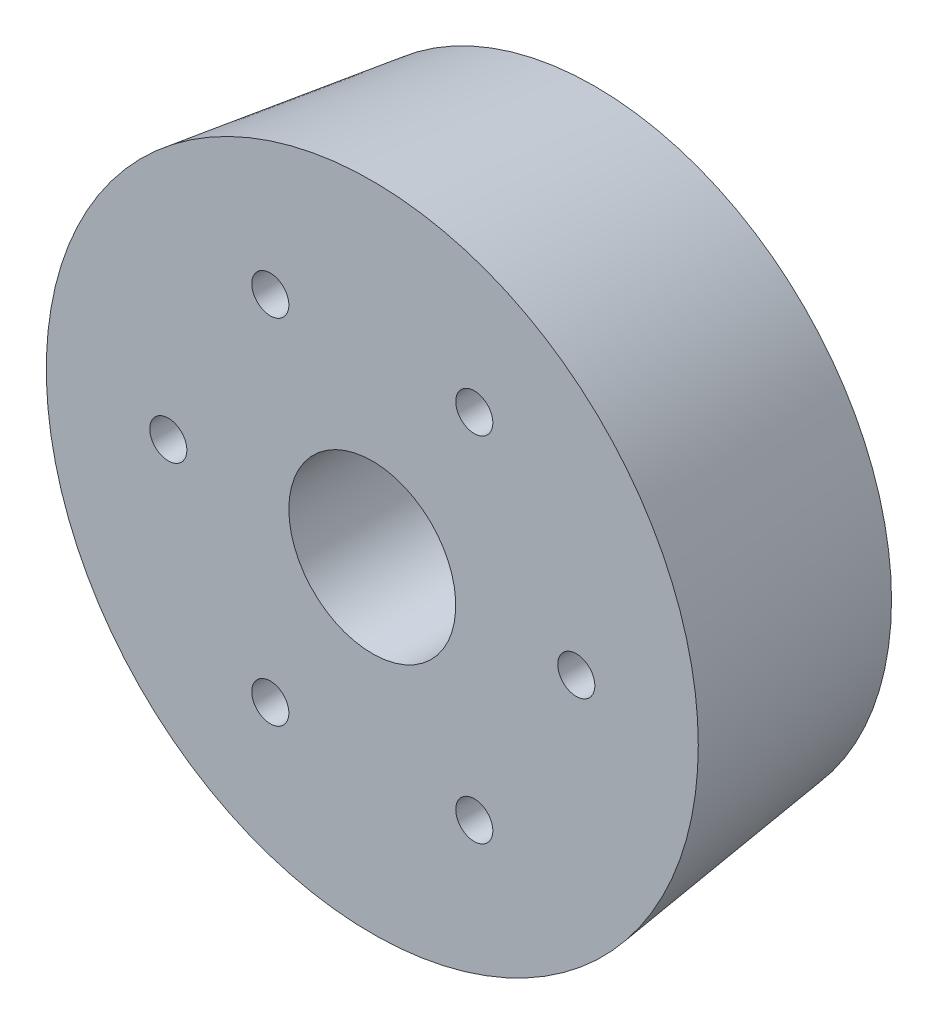
ISO-10303-21;
HEADER;
FILE_DESCRIPTION(('STEP AP214'),'2;1');
FILE_NAME('part.step','',(''),(''),'','','');
FILE_SCHEMA(('AUTOMOTIVE_DESIGN { 1 0 10303 214 1 1 1 1 }'));
ENDSEC;
DATA;
#1=APPLICATION_CONTEXT('core data for automotive mechanical design processes');
#2=APPLICATION_PROTOCOL_DEFINITION('international standard','automotive_design',2000,#1);
#3=PRODUCT_CONTEXT('',#1,'mechanical');
#4=PRODUCT('Part','Part','',(#3));
#5=PRODUCT_RELATED_PRODUCT_CATEGORY('part','',(#4));
#6=PRODUCT_DEFINITION_FORMATION('','',#4);
#7=PRODUCT_DEFINITION_CONTEXT('part definition',#1,'design');
#8=PRODUCT_DEFINITION('design','',#6,#7);
#9=PRODUCT_DEFINITION_SHAPE('','',#8);
#10=(LENGTH_UNIT() NAMED_UNIT(*) SI_UNIT(.MILLI.,.METRE.));
#11=(NAMED_UNIT(*) PLANE_ANGLE_UNIT() SI_UNIT($,.RADIAN.));
#12=(NAMED_UNIT(*) SI_UNIT($,.STERADIAN.) SOLID_ANGLE_UNIT());
#13=UNCERTAINTY_MEASURE_WITH_UNIT(LENGTH_MEASURE(1.E-05),#10,'distance_accuracy_value','');
#14=(GEOMETRIC_REPRESENTATION_CONTEXT(3) GLOBAL_UNCERTAINTY_ASSIGNED_CONTEXT((#13)) GLOBAL_UNIT_ASSIGNED_CONTEXT((#10,
#11,#12)) REPRESENTATION_CONTEXT('',''));
#15=CARTESIAN_POINT('',(0.,0.,0.));
#16=DIRECTION('',(0.,0.,1.));
#17=DIRECTION('',(1.,0.,0.));
#18=AXIS2_PLACEMENT_3D('',#15,#16,#17);
#19=CARTESIAN_POINT('',(0.,0.,0.));
#20=DIRECTION('',(0.,0.,1.));
#21=DIRECTION('',(1.,0.,0.));
#22=AXIS2_PLACEMENT_3D('',#19,#20,#21);
#23=CONICAL_SURFACE('',#22,50.8,0.130899693899575);
#24=CARTESIAN_POINT('',(0.,0.,38.1));
#25=DIRECTION('',(0.,0.,1.));
#26=DIRECTION('',(1.,0.,0.));
#27=AXIS2_PLACEMENT_3D('',#24,#25,#26);
#28=CIRCLE('',#27,55.8159601580798);
#29=CARTESIAN_POINT('',(55.8159601580798,0.,38.1));
#30=VERTEX_POINT('',#29);
#31=EDGE_CURVE('E10',#30,#30,#28,.T.);
#32=ORIENTED_EDGE('',*,*,#31,.F.);
#33=EDGE_LOOP('',(#32));
#34=FACE_BOUND('',#33,.T.);
#35=CARTESIAN_POINT('',(0.,0.,0.));
#36=DIRECTION('',(0.,0.,1.));
#37=DIRECTION('',(1.,0.,0.));
#38=AXIS2_PLACEMENT_3D('',#35,#36,#37);
#39=CIRCLE('',#38,50.8);
#40=CARTESIAN_POINT('',(50.8,0.,0.));
#41=VERTEX_POINT('',#40);
#42=EDGE_CURVE('E39',#41,#41,#39,.T.);
#43=ORIENTED_EDGE('',*,*,#42,.T.);
#44=EDGE_LOOP('',(#43));
#45=FACE_BOUND('',#44,.T.);
#46=ADVANCED_FACE('F33',(#34,#45),#23,.T.);
#47=CARTESIAN_POINT('',(0.,0.,38.1));
#48=DIRECTION('',(0.,0.,1.));
#49=DIRECTION('',(1.,0.,0.));
#50=AXIS2_PLACEMENT_3D('',#47,#48,#49);
#51=PLANE('',#50);
#52=CARTESIAN_POINT('',(-17.4625000000004,30.2459372271713,38.1));
#53=DIRECTION('',(0.,0.,-1.));
#54=DIRECTION('',(-1.,0.,0.));
#55=AXIS2_PLACEMENT_3D('',#52,#53,#54);
#56=CIRCLE('',#55,3.175);
#57=CARTESIAN_POINT('',(-20.6375000000004,30.2459372271713,38.1));
#58=VERTEX_POINT('',#57);
#59=EDGE_CURVE('E84',#58,#58,#56,.T.);
#60=ORIENTED_EDGE('',*,*,#59,.T.);
#61=EDGE_LOOP('',(#60));
#62=FACE_BOUND('',#61,.T.);
#63=CARTESIAN_POINT('',(17.4624999999997,30.2459372271717,38.1));
#64=DIRECTION('',(0.,0.,-1.));
#65=DIRECTION('',(-1.,0.,0.));
#66=AXIS2_PLACEMENT_3D('',#63,#64,#65);
#67=CIRCLE('',#66,3.175);
#68=CARTESIAN_POINT('',(14.2874999999997,30.2459372271717,38.1));
#69=VERTEX_POINT('',#68);
#70=EDGE_CURVE('E78',#69,#69,#67,.T.);
#71=ORIENTED_EDGE('',*,*,#70,.T.);
#72=EDGE_LOOP('',(#71));
#73=FACE_BOUND('',#72,.T.);
#74=CARTESIAN_POINT('',(34.925,2.43879971518193E-13,38.1));
#75=DIRECTION('',(0.,0.,-1.));
#76=DIRECTION('',(-1.,0.,0.));
#77=AXIS2_PLACEMENT_3D('',#74,#75,#76);
#78=CIRCLE('',#77,3.175);
#79=CARTESIAN_POINT('',(31.75,2.43879971518193E-13,38.1));
#80=VERTEX_POINT('',#79);
#81=EDGE_CURVE('E72',#80,#80,#78,.T.);
#82=ORIENTED_EDGE('',*,*,#81,.T.);
#83=EDGE_LOOP('',(#82));
#84=FACE_BOUND('',#83,.T.);
#85=CARTESIAN_POINT('',(17.4625000000001,-30.2459372271714,38.1));
#86=DIRECTION('',(0.,0.,-1.));
#87=DIRECTION('',(-1.,0.,0.));
#88=AXIS2_PLACEMENT_3D('',#85,#86,#87);
#89=CIRCLE('',#88,3.175);
#90=CARTESIAN_POINT('',(14.2875000000001,-30.2459372271714,38.1));
#91=VERTEX_POINT('',#90);
#92=EDGE_CURVE('E66',#91,#91,#89,.T.);
#93=ORIENTED_EDGE('',*,*,#92,.T.);
#94=EDGE_LOOP('',(#93));
#95=FACE_BOUND('',#94,.T.);
#96=CARTESIAN_POINT('',(-17.4624999999999,-30.2459372271716,38.1));
#97=DIRECTION('',(0.,0.,-1.));
#98=DIRECTION('',(-1.,0.,0.));
#99=AXIS2_PLACEMENT_3D('',#96,#97,#98);
#100=CIRCLE('',#99,3.17499999999999);
#101=CARTESIAN_POINT('',(-20.6374999999999,-30.2459372271716,38.1));
#102=VERTEX_POINT('',#101);
#103=EDGE_CURVE('E59',#102,#102,#100,.T.);
#104=ORIENTED_EDGE('',*,*,#103,.T.);
#105=EDGE_LOOP('',(#104));
#106=FACE_BOUND('',#105,.T.);
#107=CARTESIAN_POINT('',(-34.925,0.,38.1));
#108=DIRECTION('',(0.,0.,-1.));
#109=DIRECTION('',(-1.,0.,0.));
#110=AXIS2_PLACEMENT_3D('',#107,#108,#109);
#111=CIRCLE('',#110,3.175);
#112=CARTESIAN_POINT('',(-38.1,0.,38.1));
#113=VERTEX_POINT('',#112);
#114=EDGE_CURVE('E54',#113,#113,#111,.T.);
#115=ORIENTED_EDGE('',*,*,#114,.T.);
#116=EDGE_LOOP('',(#115));
#117=FACE_BOUND('',#116,.T.);
#118=CARTESIAN_POINT('',(0.,0.,38.1));
#119=DIRECTION('',(0.,0.,-1.));
#120=DIRECTION('',(-1.,0.,0.));
#121=AXIS2_PLACEMENT_3D('',#118,#119,#120);
#122=CIRCLE('',#121,14.2875);
#123=CARTESIAN_POINT('',(-14.2875,0.,38.1));
#124=VERTEX_POINT('',#123);
#125=EDGE_CURVE('E44',#124,#124,#122,.T.);
#126=ORIENTED_EDGE('',*,*,#125,.T.);
#127=EDGE_LOOP('',(#126));
#128=FACE_BOUND('',#127,.T.);
#129=ORIENTED_EDGE('',*,*,#31,.T.);
#130=EDGE_LOOP('',(#129));
#131=FACE_BOUND('',#130,.T.);
#132=ADVANCED_FACE('F93',(#62,#73,#84,#95,#106,#117,#128,#131),#51,.T.);
#133=CARTESIAN_POINT('',(0.,0.,0.));
#134=DIRECTION('',(0.,0.,1.));
#135=DIRECTION('',(1.,0.,0.));
#136=AXIS2_PLACEMENT_3D('',#133,#134,#135);
#137=PLANE('',#136);
#138=CARTESIAN_POINT('',(-17.4625000000004,30.2459372271713,0.));
#139=DIRECTION('',(0.,0.,-1.));
#140=DIRECTION('',(-1.,0.,0.));
#141=AXIS2_PLACEMENT_3D('',#138,#139,#140);
#142=CIRCLE('',#141,3.175);
#143=CARTESIAN_POINT('',(-20.6375000000004,30.2459372271713,0.));
#144=VERTEX_POINT('',#143);
#145=EDGE_CURVE('E87',#144,#144,#142,.T.);
#146=ORIENTED_EDGE('',*,*,#145,.F.);
#147=EDGE_LOOP('',(#146));
#148=FACE_BOUND('',#147,.T.);
#149=CARTESIAN_POINT('',(17.4624999999997,30.2459372271717,0.));
#150=DIRECTION('',(0.,0.,-1.));
#151=DIRECTION('',(-1.,0.,0.));
#152=AXIS2_PLACEMENT_3D('',#149,#150,#151);
#153=CIRCLE('',#152,3.175);
#154=CARTESIAN_POINT('',(14.2874999999997,30.2459372271717,0.));
#155=VERTEX_POINT('',#154);
#156=EDGE_CURVE('E81',#155,#155,#153,.T.);
#157=ORIENTED_EDGE('',*,*,#156,.F.);
#158=EDGE_LOOP('',(#157));
#159=FACE_BOUND('',#158,.T.);
#160=CARTESIAN_POINT('',(34.925,2.43879971518193E-13,0.));
#161=DIRECTION('',(0.,0.,-1.));
#162=DIRECTION('',(-1.,0.,0.));
#163=AXIS2_PLACEMENT_3D('',#160,#161,#162);
#164=CIRCLE('',#163,3.175);
#165=CARTESIAN_POINT('',(31.75,2.43879971518193E-13,0.));
#166=VERTEX_POINT('',#165);
#167=EDGE_CURVE('E75',#166,#166,#164,.T.);
#168=ORIENTED_EDGE('',*,*,#167,.F.);
#169=EDGE_LOOP('',(#168));
#170=FACE_BOUND('',#169,.T.);
#171=CARTESIAN_POINT('',(17.4625000000001,-30.2459372271714,0.));
#172=DIRECTION('',(0.,0.,-1.));
#173=DIRECTION('',(-1.,0.,0.));
#174=AXIS2_PLACEMENT_3D('',#171,#172,#173);
#175=CIRCLE('',#174,3.175);
#176=CARTESIAN_POINT('',(14.2875000000001,-30.2459372271714,0.));
#177=VERTEX_POINT('',#176);
#178=EDGE_CURVE('E69',#177,#177,#175,.T.);
#179=ORIENTED_EDGE('',*,*,#178,.F.);
#180=EDGE_LOOP('',(#179));
#181=FACE_BOUND('',#180,.T.);
#182=CARTESIAN_POINT('',(-17.4624999999999,-30.2459372271716,0.));
#183=DIRECTION('',(0.,0.,-1.));
#184=DIRECTION('',(-1.,0.,0.));
#185=AXIS2_PLACEMENT_3D('',#182,#183,#184);
#186=CIRCLE('',#185,3.17499999999999);
#187=CARTESIAN_POINT('',(-20.6374999999999,-30.2459372271716,0.));
#188=VERTEX_POINT('',#187);
#189=EDGE_CURVE('E63',#188,#188,#186,.T.);
#190=ORIENTED_EDGE('',*,*,#189,.F.);
#191=EDGE_LOOP('',(#190));
#192=FACE_BOUND('',#191,.T.);
#193=CARTESIAN_POINT('',(-34.925,0.,0.));
#194=DIRECTION('',(0.,0.,-1.));
#195=DIRECTION('',(-1.,0.,0.));
#196=AXIS2_PLACEMENT_3D('',#193,#194,#195);
#197=CIRCLE('',#196,3.175);
#198=CARTESIAN_POINT('',(-38.1,0.,0.));
#199=VERTEX_POINT('',#198);
#200=EDGE_CURVE('E56',#199,#199,#197,.T.);
#201=ORIENTED_EDGE('',*,*,#200,.F.);
#202=EDGE_LOOP('',(#201));
#203=FACE_BOUND('',#202,.T.);
#204=CARTESIAN_POINT('',(0.,0.,0.));
#205=DIRECTION('',(0.,0.,-1.));
#206=DIRECTION('',(-1.,0.,0.));
#207=AXIS2_PLACEMENT_3D('',#204,#205,#206);
#208=CIRCLE('',#207,14.2875);
#209=CARTESIAN_POINT('',(-14.2875,0.,0.));
#210=VERTEX_POINT('',#209);
#211=EDGE_CURVE('E50',#210,#210,#208,.T.);
#212=ORIENTED_EDGE('',*,*,#211,.F.);
#213=EDGE_LOOP('',(#212));
#214=FACE_BOUND('',#213,.T.);
#215=ORIENTED_EDGE('',*,*,#42,.F.);
#216=EDGE_LOOP('',(#215));
#217=FACE_BOUND('',#216,.T.);
#218=ADVANCED_FACE('F103',(#148,#159,#170,#181,#192,#203,#214,#217),#137,.F.);
#219=CARTESIAN_POINT('',(0.,0.,38.1));
#220=DIRECTION('',(0.,0.,-1.));
#221=DIRECTION('',(-1.,0.,0.));
#222=AXIS2_PLACEMENT_3D('',#219,#220,#221);
#223=CYLINDRICAL_SURFACE('',#222,14.2875);
#224=CARTESIAN_POINT('',(-14.2875,0.,38.1));
#225=CARTESIAN_POINT('',(-14.2875,0.,37.703125));
#226=CARTESIAN_POINT('',(-14.2875,0.,37.30625));
#227=CARTESIAN_POINT('',(-14.2875,0.,36.5125));
#228=CARTESIAN_POINT('',(-14.2875,0.,36.115625));
#229=CARTESIAN_POINT('',(-14.2875,0.,35.321875));
#230=CARTESIAN_POINT('',(-14.2875,0.,34.925));
#231=CARTESIAN_POINT('',(-14.2875,0.,34.13125));
#232=CARTESIAN_POINT('',(-14.2875,0.,33.734375));
#233=CARTESIAN_POINT('',(-14.2875,0.,32.940625));
#234=CARTESIAN_POINT('',(-14.2875,0.,32.54375));
#235=CARTESIAN_POINT('',(-14.2875,0.,31.75));
#236=CARTESIAN_POINT('',(-14.2875,0.,31.353125));
#237=CARTESIAN_POINT('',(-14.2875,0.,30.559375));
#238=CARTESIAN_POINT('',(-14.2875,0.,30.1625));
#239=CARTESIAN_POINT('',(-14.2875,0.,29.36875));
#240=CARTESIAN_POINT('',(-14.2875,0.,28.971875));
#241=CARTESIAN_POINT('',(-14.2875,0.,28.178125));
#242=CARTESIAN_POINT('',(-14.2875,0.,27.78125));
#243=CARTESIAN_POINT('',(-14.2875,0.,26.9875));
#244=CARTESIAN_POINT('',(-14.2875,0.,26.590625));
#245=CARTESIAN_POINT('',(-14.2875,0.,25.796875));
#246=CARTESIAN_POINT('',(-14.2875,0.,25.4));
#247=CARTESIAN_POINT('',(-14.2875,0.,24.60625));
#248=CARTESIAN_POINT('',(-14.2875,0.,24.209375));
#249=CARTESIAN_POINT('',(-14.2875,0.,23.415625));
#250=CARTESIAN_POINT('',(-14.2875,0.,23.01875));
#251=CARTESIAN_POINT('',(-14.2875,0.,22.225));
#252=CARTESIAN_POINT('',(-14.2875,0.,21.828125));
#253=CARTESIAN_POINT('',(-14.2875,0.,21.034375));
#254=CARTESIAN_POINT('',(-14.2875,0.,20.6375));
#255=CARTESIAN_POINT('',(-14.2875,0.,19.84375));
#256=CARTESIAN_POINT('',(-14.2875,0.,19.446875));
#257=CARTESIAN_POINT('',(-14.2875,0.,18.653125));
#258=CARTESIAN_POINT('',(-14.2875,0.,18.25625));
#259=CARTESIAN_POINT('',(-14.2875,0.,17.4625));
#260=CARTESIAN_POINT('',(-14.2875,0.,17.065625));
#261=CARTESIAN_POINT('',(-14.2875,0.,16.271875));
#262=CARTESIAN_POINT('',(-14.2875,0.,15.875));
#263=CARTESIAN_POINT('',(-14.2875,0.,15.08125));
#264=CARTESIAN_POINT('',(-14.2875,0.,14.684375));
#265=CARTESIAN_POINT('',(-14.2875,0.,13.890625));
#266=CARTESIAN_POINT('',(-14.2875,0.,13.49375));
#267=CARTESIAN_POINT('',(-14.2875,0.,12.7));
#268=CARTESIAN_POINT('',(-14.2875,0.,12.303125));
#269=CARTESIAN_POINT('',(-14.2875,0.,11.509375));
#270=CARTESIAN_POINT('',(-14.2875,0.,11.1125));
#271=CARTESIAN_POINT('',(-14.2875,0.,10.31875));
#272=CARTESIAN_POINT('',(-14.2875,0.,9.921875));
#273=CARTESIAN_POINT('',(-14.2875,0.,9.128125));
#274=CARTESIAN_POINT('',(-14.2875,0.,8.73125));
#275=CARTESIAN_POINT('',(-14.2875,0.,7.9375));
#276=CARTESIAN_POINT('',(-14.2875,0.,7.540625));
#277=CARTESIAN_POINT('',(-14.2875,0.,6.746875));
#278=CARTESIAN_POINT('',(-14.2875,0.,6.35));
#279=CARTESIAN_POINT('',(-14.2875,0.,5.55625));
#280=CARTESIAN_POINT('',(-14.2875,0.,5.159375));
#281=CARTESIAN_POINT('',(-14.2875,0.,4.365625));
#282=CARTESIAN_POINT('',(-14.2875,0.,3.96875));
#283=CARTESIAN_POINT('',(-14.2875,0.,3.175));
#284=CARTESIAN_POINT('',(-14.2875,0.,2.778125));
#285=CARTESIAN_POINT('',(-14.2875,0.,1.984375));
#286=CARTESIAN_POINT('',(-14.2875,0.,1.5875));
#287=CARTESIAN_POINT('',(-14.2875,0.,0.79375));
#288=CARTESIAN_POINT('',(-14.2875,0.,0.396875));
#289=CARTESIAN_POINT('',(-14.2875,0.,0.));
#290=B_SPLINE_CURVE_WITH_KNOTS('',3,(#224,#225,#226,#227,#228,#229,#230,#231,#232,#233,#234,
#235,#236,#237,#238,#239,#240,#241,#242,#243,#244,#245,#246,#247,#248,#249,#250,#251,#252,#253,
#254,#255,#256,#257,#258,#259,#260,#261,#262,#263,#264,#265,#266,#267,#268,#269,#270,#271,#272,
#273,#274,#275,#276,#277,#278,#279,#280,#281,#282,#283,#284,#285,#286,#287,#288,#289),
.UNSPECIFIED.,.F.,.F.,(4,2,2,2,2,2,2,2,2,2,2,2,2,2,2,2,2,2,2,2,2,2,2,2,2,2,2,2,2,2,2,2,4),(0.,
1.190625,2.38125,3.571875,4.7625,5.953125,7.14375,8.334375,9.52500000000001,10.715625,11.90625,
13.096875,14.2875,15.478125,16.66875,17.859375,19.05,20.240625,21.43125,22.621875,23.8125,
25.003125,26.19375,27.384375,28.575,29.765625,30.95625,32.146875,33.3375,34.528125,35.71875,
36.909375,38.1),.UNSPECIFIED.);
#291=EDGE_CURVE('BSEAM106',#124,#210,#290,.T.);
#292=ORIENTED_EDGE('',*,*,#125,.F.);
#293=ORIENTED_EDGE('',*,*,#211,.T.);
#294=ORIENTED_EDGE('',*,*,#291,.T.);
#295=ORIENTED_EDGE('',*,*,#291,.F.);
#296=EDGE_LOOP('',(#292,#294,#293,#295));
#297=FACE_BOUND('',#296,.T.);
#298=ADVANCED_FACE('F106',(#297),#223,.F.);
#299=CARTESIAN_POINT('',(-34.925,0.,38.1));
#300=DIRECTION('',(0.,0.,-1.));
#301=DIRECTION('',(-1.,0.,0.));
#302=AXIS2_PLACEMENT_3D('',#299,#300,#301);
#303=CYLINDRICAL_SURFACE('',#302,3.175);
#304=CARTESIAN_POINT('',(-38.1,0.,38.1));
#305=CARTESIAN_POINT('',(-38.1,0.,37.703125));
#306=CARTESIAN_POINT('',(-38.1,0.,37.30625));
#307=CARTESIAN_POINT('',(-38.1,0.,36.5125));
#308=CARTESIAN_POINT('',(-38.1,0.,36.115625));
#309=CARTESIAN_POINT('',(-38.1,0.,35.321875));
#310=CARTESIAN_POINT('',(-38.1,0.,34.925));
#311=CARTESIAN_POINT('',(-38.1,0.,34.13125));
#312=CARTESIAN_POINT('',(-38.1,0.,33.734375));
#313=CARTESIAN_POINT('',(-38.1,0.,32.940625));
#314=CARTESIAN_POINT('',(-38.1,0.,32.54375));
#315=CARTESIAN_POINT('',(-38.1,0.,31.75));
#316=CARTESIAN_POINT('',(-38.1,0.,31.353125));
#317=CARTESIAN_POINT('',(-38.1,0.,30.559375));
#318=CARTESIAN_POINT('',(-38.1,0.,30.1625));
#319=CARTESIAN_POINT('',(-38.1,0.,29.36875));
#320=CARTESIAN_POINT('',(-38.1,0.,28.971875));
#321=CARTESIAN_POINT('',(-38.1,0.,28.178125));
#322=CARTESIAN_POINT('',(-38.1,0.,27.78125));
#323=CARTESIAN_POINT('',(-38.1,0.,26.9875));
#324=CARTESIAN_POINT('',(-38.1,0.,26.590625));
#325=CARTESIAN_POINT('',(-38.1,0.,25.796875));
#326=CARTESIAN_POINT('',(-38.1,0.,25.4));
#327=CARTESIAN_POINT('',(-38.1,0.,24.60625));
#328=CARTESIAN_POINT('',(-38.1,0.,24.209375));
#329=CARTESIAN_POINT('',(-38.1,0.,23.415625));
#330=CARTESIAN_POINT('',(-38.1,0.,23.01875));
#331=CARTESIAN_POINT('',(-38.1,0.,22.225));
#332=CARTESIAN_POINT('',(-38.1,0.,21.828125));
#333=CARTESIAN_POINT('',(-38.1,0.,21.034375));
#334=CARTESIAN_POINT('',(-38.1,0.,20.6375));
#335=CARTESIAN_POINT('',(-38.1,0.,19.84375));
#336=CARTESIAN_POINT('',(-38.1,0.,19.446875));
#337=CARTESIAN_POINT('',(-38.1,0.,18.653125));
#338=CARTESIAN_POINT('',(-38.1,0.,18.25625));
#339=CARTESIAN_POINT('',(-38.1,0.,17.4625));
#340=CARTESIAN_POINT('',(-38.1,0.,17.065625));
#341=CARTESIAN_POINT('',(-38.1,0.,16.271875));
#342=CARTESIAN_POINT('',(-38.1,0.,15.875));
#343=CARTESIAN_POINT('',(-38.1,0.,15.08125));
#344=CARTESIAN_POINT('',(-38.1,0.,14.684375));
#345=CARTESIAN_POINT('',(-38.1,0.,13.890625));
#346=CARTESIAN_POINT('',(-38.1,0.,13.49375));
#347=CARTESIAN_POINT('',(-38.1,0.,12.7));
#348=CARTESIAN_POINT('',(-38.1,0.,12.303125));
#349=CARTESIAN_POINT('',(-38.1,0.,11.509375));
#350=CARTESIAN_POINT('',(-38.1,0.,11.1125));
#351=CARTESIAN_POINT('',(-38.1,0.,10.31875));
#352=CARTESIAN_POINT('',(-38.1,0.,9.921875));
#353=CARTESIAN_POINT('',(-38.1,0.,9.128125));
#354=CARTESIAN_POINT('',(-38.1,0.,8.73125));
#355=CARTESIAN_POINT('',(-38.1,0.,7.9375));
#356=CARTESIAN_POINT('',(-38.1,0.,7.540625));
#357=CARTESIAN_POINT('',(-38.1,0.,6.746875));
#358=CARTESIAN_POINT('',(-38.1,0.,6.35));
#359=CARTESIAN_POINT('',(-38.1,0.,5.55625));
#360=CARTESIAN_POINT('',(-38.1,0.,5.159375));
#361=CARTESIAN_POINT('',(-38.1,0.,4.365625));
#362=CARTESIAN_POINT('',(-38.1,0.,3.96875));
#363=CARTESIAN_POINT('',(-38.1,0.,3.175));
#364=CARTESIAN_POINT('',(-38.1,0.,2.778125));
#365=CARTESIAN_POINT('',(-38.1,0.,1.984375));
#366=CARTESIAN_POINT('',(-38.1,0.,1.5875));
#367=CARTESIAN_POINT('',(-38.1,0.,0.79375));
#368=CARTESIAN_POINT('',(-38.1,0.,0.396875));
#369=CARTESIAN_POINT('',(-38.1,0.,0.));
#370=B_SPLINE_CURVE_WITH_KNOTS('',3,(#304,#305,#306,#307,#308,#309,#310,#311,#312,#313,#314,
#315,#316,#317,#318,#319,#320,#321,#322,#323,#324,#325,#326,#327,#328,#329,#330,#331,#332,#333,
#334,#335,#336,#337,#338,#339,#340,#341,#342,#343,#344,#345,#346,#347,#348,#349,#350,#351,#352,
#353,#354,#355,#356,#357,#358,#359,#360,#361,#362,#363,#364,#365,#366,#367,#368,#369),
.UNSPECIFIED.,.F.,.F.,(4,2,2,2,2,2,2,2,2,2,2,2,2,2,2,2,2,2,2,2,2,2,2,2,2,2,2,2,2,2,2,2,4),(0.,
1.190625,2.38125,3.571875,4.7625,5.953125,7.14375,8.334375,9.52500000000001,10.715625,11.90625,
13.096875,14.2875,15.478125,16.66875,17.859375,19.05,20.240625,21.43125,22.621875,23.8125,
25.003125,26.19375,27.384375,28.575,29.765625,30.95625,32.146875,33.3375,34.528125,35.71875,
36.909375,38.1),.UNSPECIFIED.);
#371=EDGE_CURVE('BSEAM121',#113,#199,#370,.T.);
#372=ORIENTED_EDGE('',*,*,#114,.F.);
#373=ORIENTED_EDGE('',*,*,#200,.T.);
#374=ORIENTED_EDGE('',*,*,#371,.T.);
#375=ORIENTED_EDGE('',*,*,#371,.F.);
#376=EDGE_LOOP('',(#372,#374,#373,#375));
#377=FACE_BOUND('',#376,.T.);
#378=ADVANCED_FACE('F121',(#377),#303,.F.);
#379=CARTESIAN_POINT('',(-17.4624999999999,-30.2459372271716,38.1));
#380=DIRECTION('',(0.,0.,-1.));
#381=DIRECTION('',(-1.,0.,0.));
#382=AXIS2_PLACEMENT_3D('',#379,#380,#381);
#383=CYLINDRICAL_SURFACE('',#382,3.17499999999999);
#384=CARTESIAN_POINT('',(-20.6374999999999,-30.2459372271716,38.1));
#385=CARTESIAN_POINT('',(-20.6374999999999,-30.2459372271716,37.703125));
#386=CARTESIAN_POINT('',(-20.6374999999999,-30.2459372271716,37.30625));
#387=CARTESIAN_POINT('',(-20.6374999999999,-30.2459372271716,36.5125));
#388=CARTESIAN_POINT('',(-20.6374999999999,-30.2459372271716,36.115625));
#389=CARTESIAN_POINT('',(-20.6374999999999,-30.2459372271716,35.321875));
#390=CARTESIAN_POINT('',(-20.6374999999999,-30.2459372271716,34.925));
#391=CARTESIAN_POINT('',(-20.6374999999999,-30.2459372271716,34.13125));
#392=CARTESIAN_POINT('',(-20.6374999999999,-30.2459372271716,33.734375));
#393=CARTESIAN_POINT('',(-20.6374999999999,-30.2459372271716,32.940625));
#394=CARTESIAN_POINT('',(-20.6374999999999,-30.2459372271716,32.54375));
#395=CARTESIAN_POINT('',(-20.6374999999999,-30.2459372271716,31.75));
#396=CARTESIAN_POINT('',(-20.6374999999999,-30.2459372271716,31.353125));
#397=CARTESIAN_POINT('',(-20.6374999999999,-30.2459372271716,30.559375));
#398=CARTESIAN_POINT('',(-20.6374999999999,-30.2459372271716,30.1625));
#399=CARTESIAN_POINT('',(-20.6374999999999,-30.2459372271716,29.36875));
#400=CARTESIAN_POINT('',(-20.6374999999999,-30.2459372271716,28.971875));
#401=CARTESIAN_POINT('',(-20.6374999999999,-30.2459372271716,28.178125));
#402=CARTESIAN_POINT('',(-20.6374999999999,-30.2459372271716,27.78125));
#403=CARTESIAN_POINT('',(-20.6374999999999,-30.2459372271716,26.9875));
#404=CARTESIAN_POINT('',(-20.6374999999999,-30.2459372271716,26.590625));
#405=CARTESIAN_POINT('',(-20.6374999999999,-30.2459372271716,25.796875));
#406=CARTESIAN_POINT('',(-20.6374999999999,-30.2459372271716,25.4));
#407=CARTESIAN_POINT('',(-20.6374999999999,-30.2459372271716,24.60625));
#408=CARTESIAN_POINT('',(-20.6374999999999,-30.2459372271716,24.209375));
#409=CARTESIAN_POINT('',(-20.6374999999999,-30.2459372271716,23.415625));
#410=CARTESIAN_POINT('',(-20.6374999999999,-30.2459372271716,23.01875));
#411=CARTESIAN_POINT('',(-20.6374999999999,-30.2459372271716,22.225));
#412=CARTESIAN_POINT('',(-20.6374999999999,-30.2459372271716,21.828125));
#413=CARTESIAN_POINT('',(-20.6374999999999,-30.2459372271716,21.034375));
#414=CARTESIAN_POINT('',(-20.6374999999999,-30.2459372271716,20.6375));
#415=CARTESIAN_POINT('',(-20.6374999999999,-30.2459372271716,19.84375));
#416=CARTESIAN_POINT('',(-20.6374999999999,-30.2459372271716,19.446875));
#417=CARTESIAN_POINT('',(-20.6374999999999,-30.2459372271716,18.653125));
#418=CARTESIAN_POINT('',(-20.6374999999999,-30.2459372271716,18.25625));
#419=CARTESIAN_POINT('',(-20.6374999999999,-30.2459372271716,17.4625));
#420=CARTESIAN_POINT('',(-20.6374999999999,-30.2459372271716,17.065625));
#421=CARTESIAN_POINT('',(-20.6374999999999,-30.2459372271716,16.271875));
#422=CARTESIAN_POINT('',(-20.6374999999999,-30.2459372271716,15.875));
#423=CARTESIAN_POINT('',(-20.6374999999999,-30.2459372271716,15.08125));
#424=CARTESIAN_POINT('',(-20.6374999999999,-30.2459372271716,14.684375));
#425=CARTESIAN_POINT('',(-20.6374999999999,-30.2459372271716,13.890625));
#426=CARTESIAN_POINT('',(-20.6374999999999,-30.2459372271716,13.49375));
#427=CARTESIAN_POINT('',(-20.6374999999999,-30.2459372271716,12.7));
#428=CARTESIAN_POINT('',(-20.6374999999999,-30.2459372271716,12.303125));
#429=CARTESIAN_POINT('',(-20.6374999999999,-30.2459372271716,11.509375));
#430=CARTESIAN_POINT('',(-20.6374999999999,-30.2459372271716,11.1125));
#431=CARTESIAN_POINT('',(-20.6374999999999,-30.2459372271716,10.31875));
#432=CARTESIAN_POINT('',(-20.6374999999999,-30.2459372271716,9.921875));
#433=CARTESIAN_POINT('',(-20.6374999999999,-30.2459372271716,9.128125));
#434=CARTESIAN_POINT('',(-20.6374999999999,-30.2459372271716,8.73125));
#435=CARTESIAN_POINT('',(-20.6374999999999,-30.2459372271716,7.9375));
#436=CARTESIAN_POINT('',(-20.6374999999999,-30.2459372271716,7.540625));
#437=CARTESIAN_POINT('',(-20.6374999999999,-30.2459372271716,6.746875));
#438=CARTESIAN_POINT('',(-20.6374999999999,-30.2459372271716,6.35));
#439=CARTESIAN_POINT('',(-20.6374999999999,-30.2459372271716,5.55625));
#440=CARTESIAN_POINT('',(-20.6374999999999,-30.2459372271716,5.159375));
#441=CARTESIAN_POINT('',(-20.6374999999999,-30.2459372271716,4.365625));
#442=CARTESIAN_POINT('',(-20.6374999999999,-30.2459372271716,3.96875));
#443=CARTESIAN_POINT('',(-20.6374999999999,-30.2459372271716,3.175));
#444=CARTESIAN_POINT('',(-20.6374999999999,-30.2459372271716,2.778125));
#445=CARTESIAN_POINT('',(-20.6374999999999,-30.2459372271716,1.984375));
#446=CARTESIAN_POINT('',(-20.6374999999999,-30.2459372271716,1.5875));
#447=CARTESIAN_POINT('',(-20.6374999999999,-30.2459372271716,0.79375));
#448=CARTESIAN_POINT('',(-20.6374999999999,-30.2459372271716,0.396875));
#449=CARTESIAN_POINT('',(-20.6374999999999,-30.2459372271716,0.));
#450=B_SPLINE_CURVE_WITH_KNOTS('',3,(#384,#385,#386,#387,#388,#389,#390,#391,#392,#393,#394,
#395,#396,#397,#398,#399,#400,#401,#402,#403,#404,#405,#406,#407,#408,#409,#410,#411,#412,#413,
#414,#415,#416,#417,#418,#419,#420,#421,#422,#423,#424,#425,#426,#427,#428,#429,#430,#431,#432,
#433,#434,#435,#436,#437,#438,#439,#440,#441,#442,#443,#444,#445,#446,#447,#448,#449),
.UNSPECIFIED.,.F.,.F.,(4,2,2,2,2,2,2,2,2,2,2,2,2,2,2,2,2,2,2,2,2,2,2,2,2,2,2,2,2,2,2,2,4),(0.,
1.190625,2.38125,3.571875,4.7625,5.953125,7.14375,8.334375,9.52500000000001,10.715625,11.90625,
13.096875,14.2875,15.478125,16.66875,17.859375,19.05,20.240625,21.43125,22.621875,23.8125,
25.003125,26.19375,27.384375,28.575,29.765625,30.95625,32.146875,33.3375,34.528125,35.71875,
36.909375,38.1),.UNSPECIFIED.);
#451=EDGE_CURVE('BSEAM126',#102,#188,#450,.T.);
#452=ORIENTED_EDGE('',*,*,#103,.F.);
#453=ORIENTED_EDGE('',*,*,#189,.T.);
#454=ORIENTED_EDGE('',*,*,#451,.T.);
#455=ORIENTED_EDGE('',*,*,#451,.F.);
#456=EDGE_LOOP('',(#452,#454,#453,#455));
#457=FACE_BOUND('',#456,.T.);
#458=ADVANCED_FACE('F126',(#457),#383,.F.);
#459=CARTESIAN_POINT('',(17.4625000000001,-30.2459372271714,38.1));
#460=DIRECTION('',(0.,0.,-1.));
#461=DIRECTION('',(-1.,0.,0.));
#462=AXIS2_PLACEMENT_3D('',#459,#460,#461);
#463=CYLINDRICAL_SURFACE('',#462,3.175);
#464=CARTESIAN_POINT('',(14.2875000000001,-30.2459372271714,38.1));
#465=CARTESIAN_POINT('',(14.2875000000001,-30.2459372271714,37.703125));
#466=CARTESIAN_POINT('',(14.2875000000001,-30.2459372271714,37.30625));
#467=CARTESIAN_POINT('',(14.2875000000001,-30.2459372271714,36.5125));
#468=CARTESIAN_POINT('',(14.2875000000001,-30.2459372271714,36.115625));
#469=CARTESIAN_POINT('',(14.2875000000001,-30.2459372271714,35.321875));
#470=CARTESIAN_POINT('',(14.2875000000001,-30.2459372271714,34.925));
#471=CARTESIAN_POINT('',(14.2875000000001,-30.2459372271714,34.13125));
#472=CARTESIAN_POINT('',(14.2875000000001,-30.2459372271714,33.734375));
#473=CARTESIAN_POINT('',(14.2875000000001,-30.2459372271714,32.940625));
#474=CARTESIAN_POINT('',(14.2875000000001,-30.2459372271714,32.54375));
#475=CARTESIAN_POINT('',(14.2875000000001,-30.2459372271714,31.75));
#476=CARTESIAN_POINT('',(14.2875000000001,-30.2459372271714,31.353125));
#477=CARTESIAN_POINT('',(14.2875000000001,-30.2459372271714,30.559375));
#478=CARTESIAN_POINT('',(14.2875000000001,-30.2459372271714,30.1625));
#479=CARTESIAN_POINT('',(14.2875000000001,-30.2459372271714,29.36875));
#480=CARTESIAN_POINT('',(14.2875000000001,-30.2459372271714,28.971875));
#481=CARTESIAN_POINT('',(14.2875000000001,-30.2459372271714,28.178125));
#482=CARTESIAN_POINT('',(14.2875000000001,-30.2459372271714,27.78125));
#483=CARTESIAN_POINT('',(14.2875000000001,-30.2459372271714,26.9875));
#484=CARTESIAN_POINT('',(14.2875000000001,-30.2459372271714,26.590625));
#485=CARTESIAN_POINT('',(14.2875000000001,-30.2459372271714,25.796875));
#486=CARTESIAN_POINT('',(14.2875000000001,-30.2459372271714,25.4));
#487=CARTESIAN_POINT('',(14.2875000000001,-30.2459372271714,24.60625));
#488=CARTESIAN_POINT('',(14.2875000000001,-30.2459372271714,24.209375));
#489=CARTESIAN_POINT('',(14.2875000000001,-30.2459372271714,23.415625));
#490=CARTESIAN_POINT('',(14.2875000000001,-30.2459372271714,23.01875));
#491=CARTESIAN_POINT('',(14.2875000000001,-30.2459372271714,22.225));
#492=CARTESIAN_POINT('',(14.2875000000001,-30.2459372271714,21.828125));
#493=CARTESIAN_POINT('',(14.2875000000001,-30.2459372271714,21.034375));
#494=CARTESIAN_POINT('',(14.2875000000001,-30.2459372271714,20.6375));
#495=CARTESIAN_POINT('',(14.2875000000001,-30.2459372271714,19.84375));
#496=CARTESIAN_POINT('',(14.2875000000001,-30.2459372271714,19.446875));
#497=CARTESIAN_POINT('',(14.2875000000001,-30.2459372271714,18.653125));
#498=CARTESIAN_POINT('',(14.2875000000001,-30.2459372271714,18.25625));
#499=CARTESIAN_POINT('',(14.2875000000001,-30.2459372271714,17.4625));
#500=CARTESIAN_POINT('',(14.2875000000001,-30.2459372271714,17.065625));
#501=CARTESIAN_POINT('',(14.2875000000001,-30.2459372271714,16.271875));
#502=CARTESIAN_POINT('',(14.2875000000001,-30.2459372271714,15.875));
#503=CARTESIAN_POINT('',(14.2875000000001,-30.2459372271714,15.08125));
#504=CARTESIAN_POINT('',(14.2875000000001,-30.2459372271714,14.684375));
#505=CARTESIAN_POINT('',(14.2875000000001,-30.2459372271714,13.890625));
#506=CARTESIAN_POINT('',(14.2875000000001,-30.2459372271714,13.49375));
#507=CARTESIAN_POINT('',(14.2875000000001,-30.2459372271714,12.7));
#508=CARTESIAN_POINT('',(14.2875000000001,-30.2459372271714,12.303125));
#509=CARTESIAN_POINT('',(14.2875000000001,-30.2459372271714,11.509375));
#510=CARTESIAN_POINT('',(14.2875000000001,-30.2459372271714,11.1125));
#511=CARTESIAN_POINT('',(14.2875000000001,-30.2459372271714,10.31875));
#512=CARTESIAN_POINT('',(14.2875000000001,-30.2459372271714,9.921875));
#513=CARTESIAN_POINT('',(14.2875000000001,-30.2459372271714,9.128125));
#514=CARTESIAN_POINT('',(14.2875000000001,-30.2459372271714,8.73125));
#515=CARTESIAN_POINT('',(14.2875000000001,-30.2459372271714,7.9375));
#516=CARTESIAN_POINT('',(14.2875000000001,-30.2459372271714,7.540625));
#517=CARTESIAN_POINT('',(14.2875000000001,-30.2459372271714,6.746875));
#518=CARTESIAN_POINT('',(14.2875000000001,-30.2459372271714,6.35));
#519=CARTESIAN_POINT('',(14.2875000000001,-30.2459372271714,5.55625));
#520=CARTESIAN_POINT('',(14.2875000000001,-30.2459372271714,5.159375));
#521=CARTESIAN_POINT('',(14.2875000000001,-30.2459372271714,4.365625));
#522=CARTESIAN_POINT('',(14.2875000000001,-30.2459372271714,3.96875));
#523=CARTESIAN_POINT('',(14.2875000000001,-30.2459372271714,3.175));
#524=CARTESIAN_POINT('',(14.2875000000001,-30.2459372271714,2.778125));
#525=CARTESIAN_POINT('',(14.2875000000001,-30.2459372271714,1.984375));
#526=CARTESIAN_POINT('',(14.2875000000001,-30.2459372271714,1.5875));
#527=CARTESIAN_POINT('',(14.2875000000001,-30.2459372271714,0.79375));
#528=CARTESIAN_POINT('',(14.2875000000001,-30.2459372271714,0.396875));
#529=CARTESIAN_POINT('',(14.2875000000001,-30.2459372271714,0.));
#530=B_SPLINE_CURVE_WITH_KNOTS('',3,(#464,#465,#466,#467,#468,#469,#470,#471,#472,#473,#474,
#475,#476,#477,#478,#479,#480,#481,#482,#483,#484,#485,#486,#487,#488,#489,#490,#491,#492,#493,
#494,#495,#496,#497,#498,#499,#500,#501,#502,#503,#504,#505,#506,#507,#508,#509,#510,#511,#512,
#513,#514,#515,#516,#517,#518,#519,#520,#521,#522,#523,#524,#525,#526,#527,#528,#529),
.UNSPECIFIED.,.F.,.F.,(4,2,2,2,2,2,2,2,2,2,2,2,2,2,2,2,2,2,2,2,2,2,2,2,2,2,2,2,2,2,2,2,4),(0.,
1.190625,2.38125,3.571875,4.7625,5.953125,7.14375,8.334375,9.52500000000001,10.715625,11.90625,
13.096875,14.2875,15.478125,16.66875,17.859375,19.05,20.240625,21.43125,22.621875,23.8125,
25.003125,26.19375,27.384375,28.575,29.765625,30.95625,32.146875,33.3375,34.528125,35.71875,
36.909375,38.1),.UNSPECIFIED.);
#531=EDGE_CURVE('BSEAM155',#91,#177,#530,.T.);
#532=ORIENTED_EDGE('',*,*,#92,.F.);
#533=ORIENTED_EDGE('',*,*,#178,.T.);
#534=ORIENTED_EDGE('',*,*,#531,.T.);
#535=ORIENTED_EDGE('',*,*,#531,.F.);
#536=EDGE_LOOP('',(#532,#534,#533,#535));
#537=FACE_BOUND('',#536,.T.);
#538=ADVANCED_FACE('F155',(#537),#463,.F.);
#539=CARTESIAN_POINT('',(34.925,2.43879971518193E-13,38.1));
#540=DIRECTION('',(0.,0.,-1.));
#541=DIRECTION('',(-1.,0.,0.));
#542=AXIS2_PLACEMENT_3D('',#539,#540,#541);
#543=CYLINDRICAL_SURFACE('',#542,3.175);
#544=CARTESIAN_POINT('',(31.75,2.43879971518193E-13,38.1));
#545=CARTESIAN_POINT('',(31.75,2.43879971518193E-13,37.703125));
#546=CARTESIAN_POINT('',(31.75,2.43879971518193E-13,37.30625));
#547=CARTESIAN_POINT('',(31.75,2.43879971518193E-13,36.5125));
#548=CARTESIAN_POINT('',(31.75,2.43879971518193E-13,36.115625));
#549=CARTESIAN_POINT('',(31.75,2.43879971518193E-13,35.321875));
#550=CARTESIAN_POINT('',(31.75,2.43879971518193E-13,34.925));
#551=CARTESIAN_POINT('',(31.75,2.43879971518193E-13,34.13125));
#552=CARTESIAN_POINT('',(31.75,2.43879971518193E-13,33.734375));
#553=CARTESIAN_POINT('',(31.75,2.43879971518193E-13,32.940625));
#554=CARTESIAN_POINT('',(31.75,2.43879971518193E-13,32.54375));
#555=CARTESIAN_POINT('',(31.75,2.43879971518193E-13,31.75));
#556=CARTESIAN_POINT('',(31.75,2.43879971518193E-13,31.353125));
#557=CARTESIAN_POINT('',(31.75,2.43879971518193E-13,30.559375));
#558=CARTESIAN_POINT('',(31.75,2.43879971518193E-13,30.1625));
#559=CARTESIAN_POINT('',(31.75,2.43879971518193E-13,29.36875));
#560=CARTESIAN_POINT('',(31.75,2.43879971518193E-13,28.971875));
#561=CARTESIAN_POINT('',(31.75,2.43879971518193E-13,28.178125));
#562=CARTESIAN_POINT('',(31.75,2.43879971518193E-13,27.78125));
#563=CARTESIAN_POINT('',(31.75,2.43879971518193E-13,26.9875));
#564=CARTESIAN_POINT('',(31.75,2.43879971518193E-13,26.590625));
#565=CARTESIAN_POINT('',(31.75,2.43879971518193E-13,25.796875));
#566=CARTESIAN_POINT('',(31.75,2.43879971518193E-13,25.4));
#567=CARTESIAN_POINT('',(31.75,2.43879971518193E-13,24.60625));
#568=CARTESIAN_POINT('',(31.75,2.43879971518193E-13,24.209375));
#569=CARTESIAN_POINT('',(31.75,2.43879971518193E-13,23.415625));
#570=CARTESIAN_POINT('',(31.75,2.43879971518193E-13,23.01875));
#571=CARTESIAN_POINT('',(31.75,2.43879971518193E-13,22.225));
#572=CARTESIAN_POINT('',(31.75,2.43879971518193E-13,21.828125));
#573=CARTESIAN_POINT('',(31.75,2.43879971518193E-13,21.034375));
#574=CARTESIAN_POINT('',(31.75,2.43879971518193E-13,20.6375));
#575=CARTESIAN_POINT('',(31.75,2.43879971518193E-13,19.84375));
#576=CARTESIAN_POINT('',(31.75,2.43879971518193E-13,19.446875));
#577=CARTESIAN_POINT('',(31.75,2.43879971518193E-13,18.653125));
#578=CARTESIAN_POINT('',(31.75,2.43879971518193E-13,18.25625));
#579=CARTESIAN_POINT('',(31.75,2.43879971518193E-13,17.4625));
#580=CARTESIAN_POINT('',(31.75,2.43879971518193E-13,17.065625));
#581=CARTESIAN_POINT('',(31.75,2.43879971518193E-13,16.271875));
#582=CARTESIAN_POINT('',(31.75,2.43879971518193E-13,15.875));
#583=CARTESIAN_POINT('',(31.75,2.43879971518193E-13,15.08125));
#584=CARTESIAN_POINT('',(31.75,2.43879971518193E-13,14.684375));
#585=CARTESIAN_POINT('',(31.75,2.43879971518193E-13,13.890625));
#586=CARTESIAN_POINT('',(31.75,2.43879971518193E-13,13.49375));
#587=CARTESIAN_POINT('',(31.75,2.43879971518193E-13,12.7));
#588=CARTESIAN_POINT('',(31.75,2.43879971518193E-13,12.303125));
#589=CARTESIAN_POINT('',(31.75,2.43879971518193E-13,11.509375));
#590=CARTESIAN_POINT('',(31.75,2.43879971518193E-13,11.1125));
#591=CARTESIAN_POINT('',(31.75,2.43879971518193E-13,10.31875));
#592=CARTESIAN_POINT('',(31.75,2.43879971518193E-13,9.921875));
#593=CARTESIAN_POINT('',(31.75,2.43879971518193E-13,9.128125));
#594=CARTESIAN_POINT('',(31.75,2.43879971518193E-13,8.73125));
#595=CARTESIAN_POINT('',(31.75,2.43879971518193E-13,7.9375));
#596=CARTESIAN_POINT('',(31.75,2.43879971518193E-13,7.540625));
#597=CARTESIAN_POINT('',(31.75,2.43879971518193E-13,6.746875));
#598=CARTESIAN_POINT('',(31.75,2.43879971518193E-13,6.35));
#599=CARTESIAN_POINT('',(31.75,2.43879971518193E-13,5.55625));
#600=CARTESIAN_POINT('',(31.75,2.43879971518193E-13,5.159375));
#601=CARTESIAN_POINT('',(31.75,2.43879971518193E-13,4.365625));
#602=CARTESIAN_POINT('',(31.75,2.43879971518193E-13,3.96875));
#603=CARTESIAN_POINT('',(31.75,2.43879971518193E-13,3.175));
#604=CARTESIAN_POINT('',(31.75,2.43879971518193E-13,2.778125));
#605=CARTESIAN_POINT('',(31.75,2.43879971518193E-13,1.984375));
#606=CARTESIAN_POINT('',(31.75,2.43879971518193E-13,1.5875));
#607=CARTESIAN_POINT('',(31.75,2.43879971518193E-13,0.79375));
#608=CARTESIAN_POINT('',(31.75,2.43879971518193E-13,0.396875));
#609=CARTESIAN_POINT('',(31.75,2.43879971518193E-13,0.));
#610=B_SPLINE_CURVE_WITH_KNOTS('',3,(#544,#545,#546,#547,#548,#549,#550,#551,#552,#553,#554,
#555,#556,#557,#558,#559,#560,#561,#562,#563,#564,#565,#566,#567,#568,#569,#570,#571,#572,#573,
#574,#575,#576,#577,#578,#579,#580,#581,#582,#583,#584,#585,#586,#587,#588,#589,#590,#591,#592,
#593,#594,#595,#596,#597,#598,#599,#600,#601,#602,#603,#604,#605,#606,#607,#608,#609),
.UNSPECIFIED.,.F.,.F.,(4,2,2,2,2,2,2,2,2,2,2,2,2,2,2,2,2,2,2,2,2,2,2,2,2,2,2,2,2,2,2,2,4),(0.,
1.190625,2.38125,3.571875,4.7625,5.953125,7.14375,8.334375,9.52500000000001,10.715625,11.90625,
13.096875,14.2875,15.478125,16.66875,17.859375,19.05,20.240625,21.43125,22.621875,23.8125,
25.003125,26.19375,27.384375,28.575,29.765625,30.95625,32.146875,33.3375,34.528125,35.71875,
36.909375,38.1),.UNSPECIFIED.);
#611=EDGE_CURVE('BSEAM151',#80,#166,#610,.T.);
#612=ORIENTED_EDGE('',*,*,#81,.F.);
#613=ORIENTED_EDGE('',*,*,#167,.T.);
#614=ORIENTED_EDGE('',*,*,#611,.T.);
#615=ORIENTED_EDGE('',*,*,#611,.F.);
#616=EDGE_LOOP('',(#612,#614,#613,#615));
#617=FACE_BOUND('',#616,.T.);
#618=ADVANCED_FACE('F151',(#617),#543,.F.);
#619=CARTESIAN_POINT('',(17.4624999999997,30.2459372271717,38.1));
#620=DIRECTION('',(0.,0.,-1.));
#621=DIRECTION('',(-1.,0.,0.));
#622=AXIS2_PLACEMENT_3D('',#619,#620,#621);
#623=CYLINDRICAL_SURFACE('',#622,3.175);
#624=CARTESIAN_POINT('',(14.2874999999997,30.2459372271717,38.1));
#625=CARTESIAN_POINT('',(14.2874999999997,30.2459372271717,37.703125));
#626=CARTESIAN_POINT('',(14.2874999999997,30.2459372271717,37.30625));
#627=CARTESIAN_POINT('',(14.2874999999997,30.2459372271717,36.5125));
#628=CARTESIAN_POINT('',(14.2874999999997,30.2459372271717,36.115625));
#629=CARTESIAN_POINT('',(14.2874999999997,30.2459372271717,35.321875));
#630=CARTESIAN_POINT('',(14.2874999999997,30.2459372271717,34.925));
#631=CARTESIAN_POINT('',(14.2874999999997,30.2459372271717,34.13125));
#632=CARTESIAN_POINT('',(14.2874999999997,30.2459372271717,33.734375));
#633=CARTESIAN_POINT('',(14.2874999999997,30.2459372271717,32.940625));
#634=CARTESIAN_POINT('',(14.2874999999997,30.2459372271717,32.54375));
#635=CARTESIAN_POINT('',(14.2874999999997,30.2459372271717,31.75));
#636=CARTESIAN_POINT('',(14.2874999999997,30.2459372271717,31.353125));
#637=CARTESIAN_POINT('',(14.2874999999997,30.2459372271717,30.559375));
#638=CARTESIAN_POINT('',(14.2874999999997,30.2459372271717,30.1625));
#639=CARTESIAN_POINT('',(14.2874999999997,30.2459372271717,29.36875));
#640=CARTESIAN_POINT('',(14.2874999999997,30.2459372271717,28.971875));
#641=CARTESIAN_POINT('',(14.2874999999997,30.2459372271717,28.178125));
#642=CARTESIAN_POINT('',(14.2874999999997,30.2459372271717,27.78125));
#643=CARTESIAN_POINT('',(14.2874999999997,30.2459372271717,26.9875));
#644=CARTESIAN_POINT('',(14.2874999999997,30.2459372271717,26.590625));
#645=CARTESIAN_POINT('',(14.2874999999997,30.2459372271717,25.796875));
#646=CARTESIAN_POINT('',(14.2874999999997,30.2459372271717,25.4));
#647=CARTESIAN_POINT('',(14.2874999999997,30.2459372271717,24.60625));
#648=CARTESIAN_POINT('',(14.2874999999997,30.2459372271717,24.209375));
#649=CARTESIAN_POINT('',(14.2874999999997,30.2459372271717,23.415625));
#650=CARTESIAN_POINT('',(14.2874999999997,30.2459372271717,23.01875));
#651=CARTESIAN_POINT('',(14.2874999999997,30.2459372271717,22.225));
#652=CARTESIAN_POINT('',(14.2874999999997,30.2459372271717,21.828125));
#653=CARTESIAN_POINT('',(14.2874999999997,30.2459372271717,21.034375));
#654=CARTESIAN_POINT('',(14.2874999999997,30.2459372271717,20.6375));
#655=CARTESIAN_POINT('',(14.2874999999997,30.2459372271717,19.84375));
#656=CARTESIAN_POINT('',(14.2874999999997,30.2459372271717,19.446875));
#657=CARTESIAN_POINT('',(14.2874999999997,30.2459372271717,18.653125));
#658=CARTESIAN_POINT('',(14.2874999999997,30.2459372271717,18.25625));
#659=CARTESIAN_POINT('',(14.2874999999997,30.2459372271717,17.4625));
#660=CARTESIAN_POINT('',(14.2874999999997,30.2459372271717,17.065625));
#661=CARTESIAN_POINT('',(14.2874999999997,30.2459372271717,16.271875));
#662=CARTESIAN_POINT('',(14.2874999999997,30.2459372271717,15.875));
#663=CARTESIAN_POINT('',(14.2874999999997,30.2459372271717,15.08125));
#664=CARTESIAN_POINT('',(14.2874999999997,30.2459372271717,14.684375));
#665=CARTESIAN_POINT('',(14.2874999999997,30.2459372271717,13.890625));
#666=CARTESIAN_POINT('',(14.2874999999997,30.2459372271717,13.49375));
#667=CARTESIAN_POINT('',(14.2874999999997,30.2459372271717,12.7));
#668=CARTESIAN_POINT('',(14.2874999999997,30.2459372271717,12.303125));
#669=CARTESIAN_POINT('',(14.2874999999997,30.2459372271717,11.509375));
#670=CARTESIAN_POINT('',(14.2874999999997,30.2459372271717,11.1125));
#671=CARTESIAN_POINT('',(14.2874999999997,30.2459372271717,10.31875));
#672=CARTESIAN_POINT('',(14.2874999999997,30.2459372271717,9.921875));
#673=CARTESIAN_POINT('',(14.2874999999997,30.2459372271717,9.128125));
#674=CARTESIAN_POINT('',(14.2874999999997,30.2459372271717,8.73125));
#675=CARTESIAN_POINT('',(14.2874999999997,30.2459372271717,7.9375));
#676=CARTESIAN_POINT('',(14.2874999999997,30.2459372271717,7.540625));
#677=CARTESIAN_POINT('',(14.2874999999997,30.2459372271717,6.746875));
#678=CARTESIAN_POINT('',(14.2874999999997,30.2459372271717,6.35));
#679=CARTESIAN_POINT('',(14.2874999999997,30.2459372271717,5.55625));
#680=CARTESIAN_POINT('',(14.2874999999997,30.2459372271717,5.159375));
#681=CARTESIAN_POINT('',(14.2874999999997,30.2459372271717,4.365625));
#682=CARTESIAN_POINT('',(14.2874999999997,30.2459372271717,3.96875));
#683=CARTESIAN_POINT('',(14.2874999999997,30.2459372271717,3.175));
#684=CARTESIAN_POINT('',(14.2874999999997,30.2459372271717,2.778125));
#685=CARTESIAN_POINT('',(14.2874999999997,30.2459372271717,1.984375));
#686=CARTESIAN_POINT('',(14.2874999999997,30.2459372271717,1.5875));
#687=CARTESIAN_POINT('',(14.2874999999997,30.2459372271717,0.79375));
#688=CARTESIAN_POINT('',(14.2874999999997,30.2459372271717,0.396875));
#689=CARTESIAN_POINT('',(14.2874999999997,30.2459372271717,0.));
#690=B_SPLINE_CURVE_WITH_KNOTS('',3,(#624,#625,#626,#627,#628,#629,#630,#631,#632,#633,#634,
#635,#636,#637,#638,#639,#640,#641,#642,#643,#644,#645,#646,#647,#648,#649,#650,#651,#652,#653,
#654,#655,#656,#657,#658,#659,#660,#661,#662,#663,#664,#665,#666,#667,#668,#669,#670,#671,#672,
#673,#674,#675,#676,#677,#678,#679,#680,#681,#682,#683,#684,#685,#686,#687,#688,#689),
.UNSPECIFIED.,.F.,.F.,(4,2,2,2,2,2,2,2,2,2,2,2,2,2,2,2,2,2,2,2,2,2,2,2,2,2,2,2,2,2,2,2,4),(0.,
1.190625,2.38125,3.571875,4.7625,5.953125,7.14375,8.334375,9.52500000000001,10.715625,11.90625,
13.096875,14.2875,15.478125,16.66875,17.859375,19.05,20.240625,21.43125,22.621875,23.8125,
25.003125,26.19375,27.384375,28.575,29.765625,30.95625,32.146875,33.3375,34.528125,35.71875,
36.909375,38.1),.UNSPECIFIED.);
#691=EDGE_CURVE('BSEAM99',#69,#155,#690,.T.);
#692=ORIENTED_EDGE('',*,*,#70,.F.);
#693=ORIENTED_EDGE('',*,*,#156,.T.);
#694=ORIENTED_EDGE('',*,*,#691,.T.);
#695=ORIENTED_EDGE('',*,*,#691,.F.);
#696=EDGE_LOOP('',(#692,#694,#693,#695));
#697=FACE_BOUND('',#696,.T.);
#698=ADVANCED_FACE('F99',(#697),#623,.F.);
#699=CARTESIAN_POINT('',(-17.4625000000004,30.2459372271713,38.1));
#700=DIRECTION('',(0.,0.,-1.));
#701=DIRECTION('',(-1.,0.,0.));
#702=AXIS2_PLACEMENT_3D('',#699,#700,#701);
#703=CYLINDRICAL_SURFACE('',#702,3.175);
#704=CARTESIAN_POINT('',(-20.6375000000004,30.2459372271713,38.1));
#705=CARTESIAN_POINT('',(-20.6375000000004,30.2459372271713,37.703125));
#706=CARTESIAN_POINT('',(-20.6375000000004,30.2459372271713,37.30625));
#707=CARTESIAN_POINT('',(-20.6375000000004,30.2459372271713,36.5125));
#708=CARTESIAN_POINT('',(-20.6375000000004,30.2459372271713,36.115625));
#709=CARTESIAN_POINT('',(-20.6375000000004,30.2459372271713,35.321875));
#710=CARTESIAN_POINT('',(-20.6375000000004,30.2459372271713,34.925));
#711=CARTESIAN_POINT('',(-20.6375000000004,30.2459372271713,34.13125));
#712=CARTESIAN_POINT('',(-20.6375000000004,30.2459372271713,33.734375));
#713=CARTESIAN_POINT('',(-20.6375000000004,30.2459372271713,32.940625));
#714=CARTESIAN_POINT('',(-20.6375000000004,30.2459372271713,32.54375));
#715=CARTESIAN_POINT('',(-20.6375000000004,30.2459372271713,31.75));
#716=CARTESIAN_POINT('',(-20.6375000000004,30.2459372271713,31.353125));
#717=CARTESIAN_POINT('',(-20.6375000000004,30.2459372271713,30.559375));
#718=CARTESIAN_POINT('',(-20.6375000000004,30.2459372271713,30.1625));
#719=CARTESIAN_POINT('',(-20.6375000000004,30.2459372271713,29.36875));
#720=CARTESIAN_POINT('',(-20.6375000000004,30.2459372271713,28.971875));
#721=CARTESIAN_POINT('',(-20.6375000000004,30.2459372271713,28.178125));
#722=CARTESIAN_POINT('',(-20.6375000000004,30.2459372271713,27.78125));
#723=CARTESIAN_POINT('',(-20.6375000000004,30.2459372271713,26.9875));
#724=CARTESIAN_POINT('',(-20.6375000000004,30.2459372271713,26.590625));
#725=CARTESIAN_POINT('',(-20.6375000000004,30.2459372271713,25.796875));
#726=CARTESIAN_POINT('',(-20.6375000000004,30.2459372271713,25.4));
#727=CARTESIAN_POINT('',(-20.6375000000004,30.2459372271713,24.60625));
#728=CARTESIAN_POINT('',(-20.6375000000004,30.2459372271713,24.209375));
#729=CARTESIAN_POINT('',(-20.6375000000004,30.2459372271713,23.415625));
#730=CARTESIAN_POINT('',(-20.6375000000004,30.2459372271713,23.01875));
#731=CARTESIAN_POINT('',(-20.6375000000004,30.2459372271713,22.225));
#732=CARTESIAN_POINT('',(-20.6375000000004,30.2459372271713,21.828125));
#733=CARTESIAN_POINT('',(-20.6375000000004,30.2459372271713,21.034375));
#734=CARTESIAN_POINT('',(-20.6375000000004,30.2459372271713,20.6375));
#735=CARTESIAN_POINT('',(-20.6375000000004,30.2459372271713,19.84375));
#736=CARTESIAN_POINT('',(-20.6375000000004,30.2459372271713,19.446875));
#737=CARTESIAN_POINT('',(-20.6375000000004,30.2459372271713,18.653125));
#738=CARTESIAN_POINT('',(-20.6375000000004,30.2459372271713,18.25625));
#739=CARTESIAN_POINT('',(-20.6375000000004,30.2459372271713,17.4625));
#740=CARTESIAN_POINT('',(-20.6375000000004,30.2459372271713,17.065625));
#741=CARTESIAN_POINT('',(-20.6375000000004,30.2459372271713,16.271875));
#742=CARTESIAN_POINT('',(-20.6375000000004,30.2459372271713,15.875));
#743=CARTESIAN_POINT('',(-20.6375000000004,30.2459372271713,15.08125));
#744=CARTESIAN_POINT('',(-20.6375000000004,30.2459372271713,14.684375));
#745=CARTESIAN_POINT('',(-20.6375000000004,30.2459372271713,13.890625));
#746=CARTESIAN_POINT('',(-20.6375000000004,30.2459372271713,13.49375));
#747=CARTESIAN_POINT('',(-20.6375000000004,30.2459372271713,12.7));
#748=CARTESIAN_POINT('',(-20.6375000000004,30.2459372271713,12.303125));
#749=CARTESIAN_POINT('',(-20.6375000000004,30.2459372271713,11.509375));
#750=CARTESIAN_POINT('',(-20.6375000000004,30.2459372271713,11.1125));
#751=CARTESIAN_POINT('',(-20.6375000000004,30.2459372271713,10.31875));
#752=CARTESIAN_POINT('',(-20.6375000000004,30.2459372271713,9.921875));
#753=CARTESIAN_POINT('',(-20.6375000000004,30.2459372271713,9.128125));
#754=CARTESIAN_POINT('',(-20.6375000000004,30.2459372271713,8.73125));
#755=CARTESIAN_POINT('',(-20.6375000000004,30.2459372271713,7.9375));
#756=CARTESIAN_POINT('',(-20.6375000000004,30.2459372271713,7.540625));
#757=CARTESIAN_POINT('',(-20.6375000000004,30.2459372271713,6.746875));
#758=CARTESIAN_POINT('',(-20.6375000000004,30.2459372271713,6.35));
#759=CARTESIAN_POINT('',(-20.6375000000004,30.2459372271713,5.55625));
#760=CARTESIAN_POINT('',(-20.6375000000004,30.2459372271713,5.159375));
#761=CARTESIAN_POINT('',(-20.6375000000004,30.2459372271713,4.365625));
#762=CARTESIAN_POINT('',(-20.6375000000004,30.2459372271713,3.96875));
#763=CARTESIAN_POINT('',(-20.6375000000004,30.2459372271713,3.175));
#764=CARTESIAN_POINT('',(-20.6375000000004,30.2459372271713,2.778125));
#765=CARTESIAN_POINT('',(-20.6375000000004,30.2459372271713,1.984375));
#766=CARTESIAN_POINT('',(-20.6375000000004,30.2459372271713,1.5875));
#767=CARTESIAN_POINT('',(-20.6375000000004,30.2459372271713,0.79375));
#768=CARTESIAN_POINT('',(-20.6375000000004,30.2459372271713,0.396875));
#769=CARTESIAN_POINT('',(-20.6375000000004,30.2459372271713,0.));
#770=B_SPLINE_CURVE_WITH_KNOTS('',3,(#704,#705,#706,#707,#708,#709,#710,#711,#712,#713,#714,
#715,#716,#717,#718,#719,#720,#721,#722,#723,#724,#725,#726,#727,#728,#729,#730,#731,#732,#733,
#734,#735,#736,#737,#738,#739,#740,#741,#742,#743,#744,#745,#746,#747,#748,#749,#750,#751,#752,
#753,#754,#755,#756,#757,#758,#759,#760,#761,#762,#763,#764,#765,#766,#767,#768,#769),
.UNSPECIFIED.,.F.,.F.,(4,2,2,2,2,2,2,2,2,2,2,2,2,2,2,2,2,2,2,2,2,2,2,2,2,2,2,2,2,2,2,2,4),(0.,
1.190625,2.38125,3.571875,4.7625,5.953125,7.14375,8.334375,9.52500000000001,10.715625,11.90625,
13.096875,14.2875,15.478125,16.66875,17.859375,19.05,20.240625,21.43125,22.621875,23.8125,
25.003125,26.19375,27.384375,28.575,29.765625,30.95625,32.146875,33.3375,34.528125,35.71875,
36.909375,38.1),.UNSPECIFIED.);
#771=EDGE_CURVE('BSEAM96',#58,#144,#770,.T.);
#772=ORIENTED_EDGE('',*,*,#59,.F.);
#773=ORIENTED_EDGE('',*,*,#145,.T.);
#774=ORIENTED_EDGE('',*,*,#771,.T.);
#775=ORIENTED_EDGE('',*,*,#771,.F.);
#776=EDGE_LOOP('',(#772,#774,#773,#775));
#777=FACE_BOUND('',#776,.T.);
#778=ADVANCED_FACE('F96',(#777),#703,.F.);
#779=CLOSED_SHELL('',(#46,#132,#218,#298,#378,#458,#538,#618,#698,#778));
#780=MANIFOLD_SOLID_BREP('B2',#779);
#781=ADVANCED_BREP_SHAPE_REPRESENTATION('',(#18,#780),#14);
#782=SHAPE_DEFINITION_REPRESENTATION(#9,#781);
ENDSEC;
END-ISO-10303-21;
